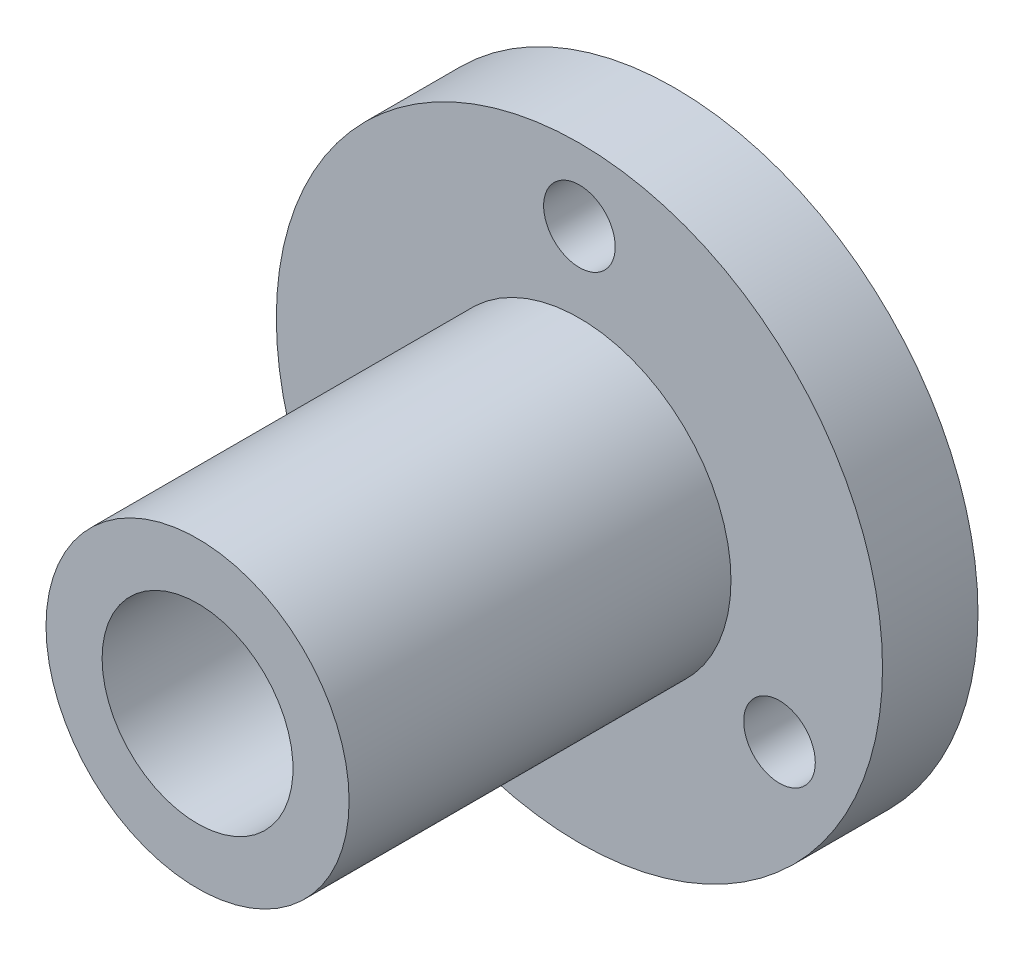
ISO-10303-21;
HEADER;
FILE_DESCRIPTION(('STEP AP214'),'2;1');
FILE_NAME('part.step','',(''),(''),'','','');
FILE_SCHEMA(('AUTOMOTIVE_DESIGN { 1 0 10303 214 1 1 1 1 }'));
ENDSEC;
DATA;
#1=APPLICATION_CONTEXT('core data for automotive mechanical design processes');
#2=APPLICATION_PROTOCOL_DEFINITION('international standard','automotive_design',2000,#1);
#3=PRODUCT_CONTEXT('',#1,'mechanical');
#4=PRODUCT('Part','Part','',(#3));
#5=PRODUCT_RELATED_PRODUCT_CATEGORY('part','',(#4));
#6=PRODUCT_DEFINITION_FORMATION('','',#4);
#7=PRODUCT_DEFINITION_CONTEXT('part definition',#1,'design');
#8=PRODUCT_DEFINITION('design','',#6,#7);
#9=PRODUCT_DEFINITION_SHAPE('','',#8);
#10=(LENGTH_UNIT() NAMED_UNIT(*) SI_UNIT(.MILLI.,.METRE.));
#11=(NAMED_UNIT(*) PLANE_ANGLE_UNIT() SI_UNIT($,.RADIAN.));
#12=(NAMED_UNIT(*) SI_UNIT($,.STERADIAN.) SOLID_ANGLE_UNIT());
#13=UNCERTAINTY_MEASURE_WITH_UNIT(LENGTH_MEASURE(1.E-05),#10,'distance_accuracy_value','');
#14=(GEOMETRIC_REPRESENTATION_CONTEXT(3) GLOBAL_UNCERTAINTY_ASSIGNED_CONTEXT((#13)) GLOBAL_UNIT_ASSIGNED_CONTEXT((#10,
#11,#12)) REPRESENTATION_CONTEXT('',''));
#15=CARTESIAN_POINT('',(0.,0.,0.));
#16=DIRECTION('',(0.,0.,1.));
#17=DIRECTION('',(1.,0.,0.));
#18=AXIS2_PLACEMENT_3D('',#15,#16,#17);
#19=CARTESIAN_POINT('',(0.,0.,4.));
#20=DIRECTION('',(0.,0.,-1.));
#21=DIRECTION('',(-1.,0.,0.));
#22=AXIS2_PLACEMENT_3D('',#19,#20,#21);
#23=CYLINDRICAL_SURFACE('',#22,12.7);
#24=CARTESIAN_POINT('',(0.,0.,4.));
#25=DIRECTION('',(0.,0.,1.));
#26=DIRECTION('',(1.,0.,0.));
#27=AXIS2_PLACEMENT_3D('',#24,#25,#26);
#28=CIRCLE('',#27,12.7);
#29=CARTESIAN_POINT('',(12.7,0.,4.));
#30=VERTEX_POINT('',#29);
#31=EDGE_CURVE('E63',#30,#30,#28,.T.);
#32=ORIENTED_EDGE('',*,*,#31,.F.);
#33=EDGE_LOOP('',(#32));
#34=FACE_BOUND('',#33,.T.);
#35=CARTESIAN_POINT('',(0.,0.,0.));
#36=DIRECTION('',(0.,0.,1.));
#37=DIRECTION('',(1.,0.,0.));
#38=AXIS2_PLACEMENT_3D('',#35,#36,#37);
#39=CIRCLE('',#38,12.7);
#40=CARTESIAN_POINT('',(12.7,0.,0.));
#41=VERTEX_POINT('',#40);
#42=EDGE_CURVE('E60',#41,#41,#39,.T.);
#43=ORIENTED_EDGE('',*,*,#42,.T.);
#44=EDGE_LOOP('',(#43));
#45=FACE_BOUND('',#44,.T.);
#46=ADVANCED_FACE('F33',(#34,#45),#23,.T.);
#47=CARTESIAN_POINT('',(0.,0.,4.));
#48=DIRECTION('',(0.,0.,1.));
#49=DIRECTION('',(1.,0.,0.));
#50=AXIS2_PLACEMENT_3D('',#47,#48,#49);
#51=PLANE('',#50);
#52=CARTESIAN_POINT('',(0.,9.67960224180029,4.));
#53=DIRECTION('',(0.,0.,1.));
#54=DIRECTION('',(1.,0.,0.));
#55=AXIS2_PLACEMENT_3D('',#52,#53,#54);
#56=CIRCLE('',#55,1.5);
#57=CARTESIAN_POINT('',(1.5,9.67960224180029,4.));
#58=VERTEX_POINT('',#57);
#59=EDGE_CURVE('E75',#58,#58,#56,.T.);
#60=ORIENTED_EDGE('',*,*,#59,.F.);
#61=EDGE_LOOP('',(#60));
#62=FACE_BOUND('',#61,.T.);
#63=CARTESIAN_POINT('',(8.38278143992783,-4.83980112090019,4.));
#64=DIRECTION('',(0.,0.,1.));
#65=DIRECTION('',(1.,0.,0.));
#66=AXIS2_PLACEMENT_3D('',#63,#64,#65);
#67=CIRCLE('',#66,1.5);
#68=CARTESIAN_POINT('',(9.88278143992783,-4.83980112090019,4.));
#69=VERTEX_POINT('',#68);
#70=EDGE_CURVE('E81',#69,#69,#67,.T.);
#71=ORIENTED_EDGE('',*,*,#70,.F.);
#72=EDGE_LOOP('',(#71));
#73=FACE_BOUND('',#72,.T.);
#74=CARTESIAN_POINT('',(-8.3827814399279,-4.83980112090007,4.));
#75=DIRECTION('',(0.,0.,1.));
#76=DIRECTION('',(1.,0.,0.));
#77=AXIS2_PLACEMENT_3D('',#74,#75,#76);
#78=CIRCLE('',#77,1.5);
#79=CARTESIAN_POINT('',(-6.8827814399279,-4.83980112090007,4.));
#80=VERTEX_POINT('',#79);
#81=EDGE_CURVE('E78',#80,#80,#78,.T.);
#82=ORIENTED_EDGE('',*,*,#81,.F.);
#83=EDGE_LOOP('',(#82));
#84=FACE_BOUND('',#83,.T.);
#85=CARTESIAN_POINT('',(0.,0.,4.));
#86=DIRECTION('',(0.,0.,1.));
#87=DIRECTION('',(1.,0.,0.));
#88=AXIS2_PLACEMENT_3D('',#85,#86,#87);
#89=CIRCLE('',#88,6.35);
#90=CARTESIAN_POINT('',(6.35,0.,4.));
#91=VERTEX_POINT('',#90);
#92=EDGE_CURVE('E59',#91,#91,#89,.T.);
#93=ORIENTED_EDGE('',*,*,#92,.F.);
#94=EDGE_LOOP('',(#93));
#95=FACE_BOUND('',#94,.T.);
#96=ORIENTED_EDGE('',*,*,#31,.T.);
#97=EDGE_LOOP('',(#96));
#98=FACE_BOUND('',#97,.T.);
#99=ADVANCED_FACE('F89',(#62,#73,#84,#95,#98),#51,.T.);
#100=CARTESIAN_POINT('',(0.,0.,0.));
#101=DIRECTION('',(0.,0.,1.));
#102=DIRECTION('',(1.,0.,0.));
#103=AXIS2_PLACEMENT_3D('',#100,#101,#102);
#104=PLANE('',#103);
#105=CARTESIAN_POINT('',(-8.3827814399279,-4.83980112090007,0.));
#106=DIRECTION('',(0.,0.,1.));
#107=DIRECTION('',(1.,0.,0.));
#108=AXIS2_PLACEMENT_3D('',#105,#106,#107);
#109=CIRCLE('',#108,3.);
#110=CARTESIAN_POINT('',(-5.3827814399279,-4.83980112090007,0.));
#111=VERTEX_POINT('',#110);
#112=EDGE_CURVE('E48',#111,#111,#109,.T.);
#113=ORIENTED_EDGE('',*,*,#112,.T.);
#114=EDGE_LOOP('',(#113));
#115=FACE_BOUND('',#114,.T.);
#116=CARTESIAN_POINT('',(8.38278143992783,-4.83980112090019,0.));
#117=DIRECTION('',(0.,0.,1.));
#118=DIRECTION('',(1.,0.,0.));
#119=AXIS2_PLACEMENT_3D('',#116,#117,#118);
#120=CIRCLE('',#119,3.);
#121=CARTESIAN_POINT('',(5.38278143992784,-4.83980112090019,0.));
#122=VERTEX_POINT('',#121);
#123=EDGE_CURVE('E53',#122,#122,#120,.T.);
#124=ORIENTED_EDGE('',*,*,#123,.T.);
#125=EDGE_LOOP('',(#124));
#126=FACE_BOUND('',#125,.T.);
#127=CARTESIAN_POINT('',(0.,9.67960224180029,0.));
#128=DIRECTION('',(0.,0.,1.));
#129=DIRECTION('',(1.,0.,0.));
#130=AXIS2_PLACEMENT_3D('',#127,#128,#129);
#131=CIRCLE('',#130,3.);
#132=CARTESIAN_POINT('',(3.,9.67960224180029,0.));
#133=VERTEX_POINT('',#132);
#134=EDGE_CURVE('E56',#133,#133,#131,.T.);
#135=ORIENTED_EDGE('',*,*,#134,.T.);
#136=EDGE_LOOP('',(#135));
#137=FACE_BOUND('',#136,.T.);
#138=CARTESIAN_POINT('',(0.,0.,0.));
#139=DIRECTION('',(0.,0.,-1.));
#140=DIRECTION('',(-1.,0.,0.));
#141=AXIS2_PLACEMENT_3D('',#138,#139,#140);
#142=CIRCLE('',#141,4.);
#143=CARTESIAN_POINT('',(-4.,0.,0.));
#144=VERTEX_POINT('',#143);
#145=EDGE_CURVE('E72',#144,#144,#142,.T.);
#146=ORIENTED_EDGE('',*,*,#145,.F.);
#147=EDGE_LOOP('',(#146));
#148=FACE_BOUND('',#147,.T.);
#149=ORIENTED_EDGE('',*,*,#42,.F.);
#150=EDGE_LOOP('',(#149));
#151=FACE_BOUND('',#150,.T.);
#152=ADVANCED_FACE('F92',(#115,#126,#137,#148,#151),#104,.F.);
#153=CARTESIAN_POINT('',(0.,0.,20.));
#154=DIRECTION('',(0.,0.,-1.));
#155=DIRECTION('',(-1.,0.,0.));
#156=AXIS2_PLACEMENT_3D('',#153,#154,#155);
#157=CYLINDRICAL_SURFACE('',#156,6.35);
#158=CARTESIAN_POINT('',(0.,0.,20.));
#159=DIRECTION('',(0.,0.,1.));
#160=DIRECTION('',(1.,0.,0.));
#161=AXIS2_PLACEMENT_3D('',#158,#159,#160);
#162=CIRCLE('',#161,6.35);
#163=CARTESIAN_POINT('',(6.35,0.,20.));
#164=VERTEX_POINT('',#163);
#165=EDGE_CURVE('E64',#164,#164,#162,.T.);
#166=ORIENTED_EDGE('',*,*,#165,.F.);
#167=EDGE_LOOP('',(#166));
#168=FACE_BOUND('',#167,.T.);
#169=ORIENTED_EDGE('',*,*,#92,.T.);
#170=EDGE_LOOP('',(#169));
#171=FACE_BOUND('',#170,.T.);
#172=ADVANCED_FACE('F108',(#168,#171),#157,.T.);
#173=CARTESIAN_POINT('',(0.,0.,20.));
#174=DIRECTION('',(0.,0.,1.));
#175=DIRECTION('',(1.,0.,0.));
#176=AXIS2_PLACEMENT_3D('',#173,#174,#175);
#177=PLANE('',#176);
#178=CARTESIAN_POINT('',(0.,0.,20.));
#179=DIRECTION('',(0.,0.,-1.));
#180=DIRECTION('',(-1.,0.,0.));
#181=AXIS2_PLACEMENT_3D('',#178,#179,#180);
#182=CIRCLE('',#181,4.);
#183=CARTESIAN_POINT('',(-4.,0.,20.));
#184=VERTEX_POINT('',#183);
#185=EDGE_CURVE('E71',#184,#184,#182,.T.);
#186=ORIENTED_EDGE('',*,*,#185,.T.);
#187=EDGE_LOOP('',(#186));
#188=FACE_BOUND('',#187,.T.);
#189=ORIENTED_EDGE('',*,*,#165,.T.);
#190=EDGE_LOOP('',(#189));
#191=FACE_BOUND('',#190,.T.);
#192=ADVANCED_FACE('F115',(#188,#191),#177,.T.);
#193=CARTESIAN_POINT('',(0.,0.,20.));
#194=DIRECTION('',(0.,0.,-1.));
#195=DIRECTION('',(-1.,0.,0.));
#196=AXIS2_PLACEMENT_3D('',#193,#194,#195);
#197=CYLINDRICAL_SURFACE('',#196,4.);
#198=ORIENTED_EDGE('',*,*,#185,.F.);
#199=EDGE_LOOP('',(#198));
#200=FACE_BOUND('',#199,.T.);
#201=ORIENTED_EDGE('',*,*,#145,.T.);
#202=EDGE_LOOP('',(#201));
#203=FACE_BOUND('',#202,.T.);
#204=ADVANCED_FACE('F137',(#200,#203),#197,.F.);
#205=CARTESIAN_POINT('',(-8.3827814399279,-4.83980112090007,0.));
#206=DIRECTION('',(0.,0.,1.));
#207=DIRECTION('',(1.,0.,0.));
#208=AXIS2_PLACEMENT_3D('',#205,#206,#207);
#209=CYLINDRICAL_SURFACE('',#208,1.5);
#210=CARTESIAN_POINT('',(-8.3827814399279,-4.83980112090007,1.50000000000001));
#211=DIRECTION('',(0.,0.,1.));
#212=DIRECTION('',(1.,0.,0.));
#213=AXIS2_PLACEMENT_3D('',#210,#211,#212);
#214=CIRCLE('',#213,1.5);
#215=CARTESIAN_POINT('',(-6.8827814399279,-4.83980112090007,1.50000000000001));
#216=VERTEX_POINT('',#215);
#217=EDGE_CURVE('E44',#216,#216,#214,.F.);
#218=ORIENTED_EDGE('',*,*,#217,.T.);
#219=EDGE_LOOP('',(#218));
#220=FACE_BOUND('',#219,.T.);
#221=ORIENTED_EDGE('',*,*,#81,.T.);
#222=EDGE_LOOP('',(#221));
#223=FACE_BOUND('',#222,.T.);
#224=ADVANCED_FACE('F139',(#220,#223),#209,.F.);
#225=CARTESIAN_POINT('',(8.38278143992783,-4.83980112090019,0.));
#226=DIRECTION('',(0.,0.,1.));
#227=DIRECTION('',(1.,0.,0.));
#228=AXIS2_PLACEMENT_3D('',#225,#226,#227);
#229=CYLINDRICAL_SURFACE('',#228,1.5);
#230=CARTESIAN_POINT('',(8.38278143992783,-4.83980112090019,1.5));
#231=DIRECTION('',(0.,0.,1.));
#232=DIRECTION('',(1.,0.,0.));
#233=AXIS2_PLACEMENT_3D('',#230,#231,#232);
#234=CIRCLE('',#233,1.5);
#235=CARTESIAN_POINT('',(6.88278143992784,-4.83980112090019,1.5));
#236=VERTEX_POINT('',#235);
#237=EDGE_CURVE('E40',#236,#236,#234,.F.);
#238=ORIENTED_EDGE('',*,*,#237,.T.);
#239=EDGE_LOOP('',(#238));
#240=FACE_BOUND('',#239,.T.);
#241=ORIENTED_EDGE('',*,*,#70,.T.);
#242=EDGE_LOOP('',(#241));
#243=FACE_BOUND('',#242,.T.);
#244=ADVANCED_FACE('F146',(#240,#243),#229,.F.);
#245=CARTESIAN_POINT('',(0.,9.67960224180029,0.));
#246=DIRECTION('',(0.,0.,1.));
#247=DIRECTION('',(1.,0.,0.));
#248=AXIS2_PLACEMENT_3D('',#245,#246,#247);
#249=CYLINDRICAL_SURFACE('',#248,1.5);
#250=CARTESIAN_POINT('',(0.,9.67960224180029,1.5));
#251=DIRECTION('',(0.,0.,1.));
#252=DIRECTION('',(1.,0.,0.));
#253=AXIS2_PLACEMENT_3D('',#250,#251,#252);
#254=CIRCLE('',#253,1.5);
#255=CARTESIAN_POINT('',(1.5,9.67960224180029,1.5));
#256=VERTEX_POINT('',#255);
#257=EDGE_CURVE('E10',#256,#256,#254,.F.);
#258=ORIENTED_EDGE('',*,*,#257,.T.);
#259=EDGE_LOOP('',(#258));
#260=FACE_BOUND('',#259,.T.);
#261=ORIENTED_EDGE('',*,*,#59,.T.);
#262=EDGE_LOOP('',(#261));
#263=FACE_BOUND('',#262,.T.);
#264=ADVANCED_FACE('F87',(#260,#263),#249,.F.);
#265=CARTESIAN_POINT('',(-8.3827814399279,-4.83980112090007,0.));
#266=DIRECTION('',(0.,0.,-1.));
#267=DIRECTION('',(-1.,0.,0.));
#268=AXIS2_PLACEMENT_3D('',#265,#266,#267);
#269=CONICAL_SURFACE('',#268,3.,0.785398163397446);
#270=ORIENTED_EDGE('',*,*,#217,.F.);
#271=EDGE_LOOP('',(#270));
#272=FACE_BOUND('',#271,.T.);
#273=ORIENTED_EDGE('',*,*,#112,.F.);
#274=EDGE_LOOP('',(#273));
#275=FACE_BOUND('',#274,.T.);
#276=ADVANCED_FACE('F120',(#272,#275),#269,.F.);
#277=CARTESIAN_POINT('',(8.38278143992783,-4.83980112090019,0.));
#278=DIRECTION('',(0.,0.,-1.));
#279=DIRECTION('',(-1.,0.,0.));
#280=AXIS2_PLACEMENT_3D('',#277,#278,#279);
#281=CONICAL_SURFACE('',#280,3.,0.785398163397447);
#282=CARTESIAN_POINT('',(6.88278143992784,-4.83980112090019,1.5));
#283=CARTESIAN_POINT('',(6.86715643992784,-4.83980112090019,1.484375));
#284=CARTESIAN_POINT('',(6.85153143992784,-4.83980112090019,1.46875));
#285=CARTESIAN_POINT('',(6.82028143992784,-4.83980112090019,1.4375));
#286=CARTESIAN_POINT('',(6.80465643992784,-4.83980112090019,1.421875));
#287=CARTESIAN_POINT('',(6.77340643992784,-4.83980112090019,1.390625));
#288=CARTESIAN_POINT('',(6.75778143992783,-4.83980112090019,1.375));
#289=CARTESIAN_POINT('',(6.72653143992783,-4.83980112090019,1.34375));
#290=CARTESIAN_POINT('',(6.71090643992783,-4.83980112090019,1.328125));
#291=CARTESIAN_POINT('',(6.67965643992783,-4.83980112090019,1.296875));
#292=CARTESIAN_POINT('',(6.66403143992783,-4.83980112090019,1.28125));
#293=CARTESIAN_POINT('',(6.63278143992783,-4.83980112090019,1.25));
#294=CARTESIAN_POINT('',(6.61715643992783,-4.83980112090019,1.234375));
#295=CARTESIAN_POINT('',(6.58590643992783,-4.83980112090019,1.203125));
#296=CARTESIAN_POINT('',(6.57028143992783,-4.83980112090019,1.1875));
#297=CARTESIAN_POINT('',(6.53903143992783,-4.83980112090019,1.15625));
#298=CARTESIAN_POINT('',(6.52340643992783,-4.83980112090019,1.140625));
#299=CARTESIAN_POINT('',(6.49215643992783,-4.83980112090019,1.109375));
#300=CARTESIAN_POINT('',(6.47653143992784,-4.83980112090019,1.09375));
#301=CARTESIAN_POINT('',(6.44528143992784,-4.83980112090019,1.0625));
#302=CARTESIAN_POINT('',(6.42965643992784,-4.83980112090019,1.046875));
#303=CARTESIAN_POINT('',(6.39840643992784,-4.83980112090019,1.015625));
#304=CARTESIAN_POINT('',(6.38278143992783,-4.83980112090019,1.));
#305=CARTESIAN_POINT('',(6.35153143992783,-4.83980112090019,0.968750000000003));
#306=CARTESIAN_POINT('',(6.33590643992784,-4.83980112090019,0.953125000000003));
#307=CARTESIAN_POINT('',(6.30465643992784,-4.83980112090019,0.921875000000003));
#308=CARTESIAN_POINT('',(6.28903143992784,-4.83980112090019,0.906250000000003));
#309=CARTESIAN_POINT('',(6.25778143992784,-4.83980112090019,0.875000000000003));
#310=CARTESIAN_POINT('',(6.24215643992784,-4.83980112090019,0.859375000000003));
#311=CARTESIAN_POINT('',(6.21090643992784,-4.83980112090019,0.828125000000003));
#312=CARTESIAN_POINT('',(6.19528143992784,-4.83980112090019,0.812500000000002));
#313=CARTESIAN_POINT('',(6.16403143992784,-4.83980112090019,0.781250000000002));
#314=CARTESIAN_POINT('',(6.14840643992784,-4.83980112090019,0.765625000000002));
#315=CARTESIAN_POINT('',(6.11715643992784,-4.83980112090019,0.734375000000002));
#316=CARTESIAN_POINT('',(6.10153143992784,-4.83980112090019,0.718750000000002));
#317=CARTESIAN_POINT('',(6.07028143992784,-4.83980112090019,0.687500000000002));
#318=CARTESIAN_POINT('',(6.05465643992784,-4.83980112090019,0.671875000000002));
#319=CARTESIAN_POINT('',(6.02340643992784,-4.83980112090019,0.640625000000002));
#320=CARTESIAN_POINT('',(6.00778143992784,-4.83980112090019,0.625000000000002));
#321=CARTESIAN_POINT('',(5.97653143992784,-4.83980112090019,0.593750000000002));
#322=CARTESIAN_POINT('',(5.96090643992784,-4.83980112090019,0.578125000000002));
#323=CARTESIAN_POINT('',(5.92965643992784,-4.83980112090019,0.546875000000002));
#324=CARTESIAN_POINT('',(5.91403143992784,-4.83980112090019,0.531250000000002));
#325=CARTESIAN_POINT('',(5.88278143992784,-4.83980112090019,0.500000000000002));
#326=CARTESIAN_POINT('',(5.86715643992784,-4.83980112090019,0.484375000000001));
#327=CARTESIAN_POINT('',(5.83590643992784,-4.83980112090019,0.453125000000001));
#328=CARTESIAN_POINT('',(5.82028143992784,-4.83980112090019,0.437500000000001));
#329=CARTESIAN_POINT('',(5.78903143992784,-4.83980112090019,0.406250000000001));
#330=CARTESIAN_POINT('',(5.77340643992784,-4.83980112090019,0.390625000000001));
#331=CARTESIAN_POINT('',(5.74215643992784,-4.83980112090019,0.359375000000001));
#332=CARTESIAN_POINT('',(5.72653143992784,-4.83980112090019,0.343750000000001));
#333=CARTESIAN_POINT('',(5.69528143992784,-4.83980112090019,0.312500000000001));
#334=CARTESIAN_POINT('',(5.67965643992784,-4.83980112090019,0.296875000000001));
#335=CARTESIAN_POINT('',(5.64840643992784,-4.83980112090019,0.265625000000001));
#336=CARTESIAN_POINT('',(5.63278143992784,-4.83980112090019,0.250000000000001));
#337=CARTESIAN_POINT('',(5.60153143992784,-4.83980112090019,0.218750000000001));
#338=CARTESIAN_POINT('',(5.58590643992784,-4.83980112090019,0.203125000000001));
#339=CARTESIAN_POINT('',(5.55465643992784,-4.83980112090019,0.171875000000001));
#340=CARTESIAN_POINT('',(5.53903143992784,-4.83980112090019,0.156250000000001));
#341=CARTESIAN_POINT('',(5.50778143992784,-4.83980112090019,0.125));
#342=CARTESIAN_POINT('',(5.49215643992784,-4.83980112090019,0.109375));
#343=CARTESIAN_POINT('',(5.46090643992784,-4.83980112090019,0.0781250000000002));
#344=CARTESIAN_POINT('',(5.44528143992784,-4.83980112090019,0.0625000000000001));
#345=CARTESIAN_POINT('',(5.41403143992784,-4.83980112090019,0.03125));
#346=CARTESIAN_POINT('',(5.39840643992784,-4.83980112090019,0.015625));
#347=CARTESIAN_POINT('',(5.38278143992784,-4.83980112090019,0.));
#348=B_SPLINE_CURVE_WITH_KNOTS('',3,(#282,#283,#284,#285,#286,#287,#288,#289,#290,#291,#292,
#293,#294,#295,#296,#297,#298,#299,#300,#301,#302,#303,#304,#305,#306,#307,#308,#309,#310,#311,
#312,#313,#314,#315,#316,#317,#318,#319,#320,#321,#322,#323,#324,#325,#326,#327,#328,#329,#330,
#331,#332,#333,#334,#335,#336,#337,#338,#339,#340,#341,#342,#343,#344,#345,#346,#347),
.UNSPECIFIED.,.F.,.F.,(4,2,2,2,2,2,2,2,2,2,2,2,2,2,2,2,2,2,2,2,2,2,2,2,2,2,2,2,2,2,2,2,4),(0.,
0.0662912607362389,0.132582521472478,0.198873782208717,0.265165042944956,0.331456303681195,
0.397747564417434,0.464038825153673,0.530330085889912,0.59662134662615,0.662912607362389,
0.729203868098629,0.795495128834867,0.861786389571106,0.928077650307345,0.994368911043584,
1.06066017177982,1.12695143251606,1.1932426932523,1.25953395398854,1.32582521472478,
1.39211647546102,1.45840773619726,1.52469899693349,1.59099025766973,1.65728151840597,
1.72357277914221,1.78986403987845,1.85615530061469,1.92244656135093,1.98873782208717,
2.05502908282341,2.12132034355965),.UNSPECIFIED.);
#349=EDGE_CURVE('BSEAM122',#236,#122,#348,.T.);
#350=ORIENTED_EDGE('',*,*,#237,.F.);
#351=ORIENTED_EDGE('',*,*,#123,.F.);
#352=ORIENTED_EDGE('',*,*,#349,.T.);
#353=ORIENTED_EDGE('',*,*,#349,.F.);
#354=EDGE_LOOP('',(#350,#352,#351,#353));
#355=FACE_BOUND('',#354,.T.);
#356=ADVANCED_FACE('F122',(#355),#281,.F.);
#357=CARTESIAN_POINT('',(0.,9.67960224180029,0.));
#358=DIRECTION('',(0.,0.,-1.));
#359=DIRECTION('',(-1.,0.,0.));
#360=AXIS2_PLACEMENT_3D('',#357,#358,#359);
#361=CONICAL_SURFACE('',#360,3.,0.785398163397447);
#362=ORIENTED_EDGE('',*,*,#257,.F.);
#363=EDGE_LOOP('',(#362));
#364=FACE_BOUND('',#363,.T.);
#365=ORIENTED_EDGE('',*,*,#134,.F.);
#366=EDGE_LOOP('',(#365));
#367=FACE_BOUND('',#366,.T.);
#368=ADVANCED_FACE('F35',(#364,#367),#361,.F.);
#369=CLOSED_SHELL('',(#46,#99,#152,#172,#192,#204,#224,#244,#264,#276,#356,#368));
#370=MANIFOLD_SOLID_BREP('B2',#369);
#371=ADVANCED_BREP_SHAPE_REPRESENTATION('',(#18,#370),#14);
#372=SHAPE_DEFINITION_REPRESENTATION(#9,#371);
ENDSEC;
END-ISO-10303-21;
